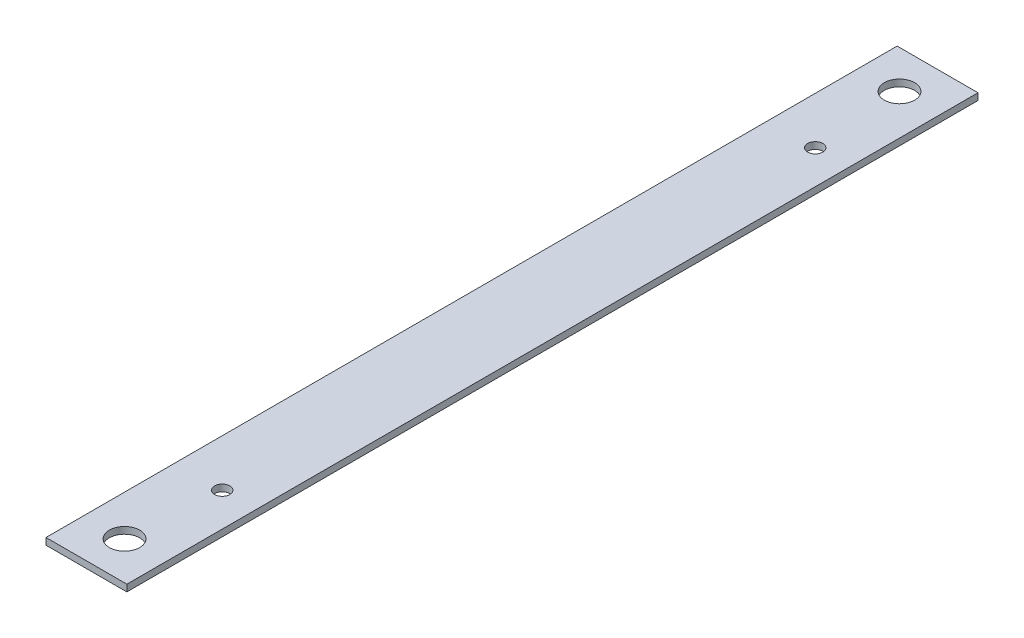
ISO-10303-21;
HEADER;
FILE_DESCRIPTION(('STEP AP214'),'2;1');
FILE_NAME('part.step','',(''),(''),'','','');
FILE_SCHEMA(('AUTOMOTIVE_DESIGN { 1 0 10303 214 1 1 1 1 }'));
ENDSEC;
DATA;
#1=APPLICATION_CONTEXT('core data for automotive mechanical design processes');
#2=APPLICATION_PROTOCOL_DEFINITION('international standard','automotive_design',2000,#1);
#3=PRODUCT_CONTEXT('',#1,'mechanical');
#4=PRODUCT('Part','Part','',(#3));
#5=PRODUCT_RELATED_PRODUCT_CATEGORY('part','',(#4));
#6=PRODUCT_DEFINITION_FORMATION('','',#4);
#7=PRODUCT_DEFINITION_CONTEXT('part definition',#1,'design');
#8=PRODUCT_DEFINITION('design','',#6,#7);
#9=PRODUCT_DEFINITION_SHAPE('','',#8);
#10=(LENGTH_UNIT() NAMED_UNIT(*) SI_UNIT(.MILLI.,.METRE.));
#11=(NAMED_UNIT(*) PLANE_ANGLE_UNIT() SI_UNIT($,.RADIAN.));
#12=(NAMED_UNIT(*) SI_UNIT($,.STERADIAN.) SOLID_ANGLE_UNIT());
#13=UNCERTAINTY_MEASURE_WITH_UNIT(LENGTH_MEASURE(1.E-05),#10,'distance_accuracy_value','');
#14=(GEOMETRIC_REPRESENTATION_CONTEXT(3) GLOBAL_UNCERTAINTY_ASSIGNED_CONTEXT((#13)) GLOBAL_UNIT_ASSIGNED_CONTEXT((#10,
#11,#12)) REPRESENTATION_CONTEXT('',''));
#15=CARTESIAN_POINT('',(0.,0.,0.));
#16=DIRECTION('',(0.,0.,1.));
#17=DIRECTION('',(1.,0.,0.));
#18=AXIS2_PLACEMENT_3D('',#15,#16,#17);
#19=CARTESIAN_POINT('',(0.,0.,401.0152));
#20=DIRECTION('',(1.,0.,0.));
#21=DIRECTION('',(0.,0.,-1.));
#22=AXIS2_PLACEMENT_3D('',#19,#20,#21);
#23=PLANE('',#22);
#24=DIRECTION('',(0.,-1.,0.));
#25=VECTOR('',#24,1.);
#26=CARTESIAN_POINT('',(0.,0.,0.));
#27=LINE('',#26,#25);
#28=CARTESIAN_POINT('',(0.,3.175,0.));
#29=VERTEX_POINT('',#28);
#30=CARTESIAN_POINT('',(0.,0.,0.));
#31=VERTEX_POINT('',#30);
#32=EDGE_CURVE('E95',#29,#31,#27,.T.);
#33=ORIENTED_EDGE('',*,*,#32,.T.);
#34=DIRECTION('',(0.,0.,-1.));
#35=VECTOR('',#34,1.);
#36=CARTESIAN_POINT('',(0.,0.,401.0152));
#37=LINE('',#36,#35);
#38=CARTESIAN_POINT('',(0.,0.,401.0152));
#39=VERTEX_POINT('',#38);
#40=EDGE_CURVE('E11',#39,#31,#37,.T.);
#41=ORIENTED_EDGE('',*,*,#40,.F.);
#42=DIRECTION('',(0.,-1.,0.));
#43=VECTOR('',#42,1.);
#44=CARTESIAN_POINT('',(0.,0.,401.0152));
#45=LINE('',#44,#43);
#46=CARTESIAN_POINT('',(0.,3.175,401.0152));
#47=VERTEX_POINT('',#46);
#48=EDGE_CURVE('E83',#47,#39,#45,.T.);
#49=ORIENTED_EDGE('',*,*,#48,.F.);
#50=DIRECTION('',(0.,0.,-1.));
#51=VECTOR('',#50,1.);
#52=CARTESIAN_POINT('',(0.,3.175,401.0152));
#53=LINE('',#52,#51);
#54=EDGE_CURVE('E91',#47,#29,#53,.T.);
#55=ORIENTED_EDGE('',*,*,#54,.T.);
#56=EDGE_LOOP('',(#33,#41,#49,#55));
#57=FACE_BOUND('',#56,.T.);
#58=ADVANCED_FACE('F32',(#57),#23,.F.);
#59=CARTESIAN_POINT('',(0.,0.,401.0152));
#60=DIRECTION('',(0.,1.,0.));
#61=DIRECTION('',(0.,0.,1.));
#62=AXIS2_PLACEMENT_3D('',#59,#60,#61);
#63=PLANE('',#62);
#64=CARTESIAN_POINT('',(22.225,0.,340.2076));
#65=DIRECTION('',(0.,1.,0.));
#66=DIRECTION('',(0.,0.,-1.));
#67=AXIS2_PLACEMENT_3D('',#64,#65,#66);
#68=CIRCLE('',#67,3.55599999999999);
#69=CARTESIAN_POINT('',(22.225,0.,336.6516));
#70=VERTEX_POINT('',#69);
#71=EDGE_CURVE('E124',#70,#70,#68,.T.);
#72=ORIENTED_EDGE('',*,*,#71,.T.);
#73=EDGE_LOOP('',(#72));
#74=FACE_BOUND('',#73,.T.);
#75=CARTESIAN_POINT('',(22.225,0.,60.8076));
#76=DIRECTION('',(0.,1.,0.));
#77=DIRECTION('',(0.,0.,1.));
#78=AXIS2_PLACEMENT_3D('',#75,#76,#77);
#79=CIRCLE('',#78,3.556);
#80=CARTESIAN_POINT('',(22.225,0.,64.3636));
#81=VERTEX_POINT('',#80);
#82=EDGE_CURVE('E118',#81,#81,#79,.T.);
#83=ORIENTED_EDGE('',*,*,#82,.T.);
#84=EDGE_LOOP('',(#83));
#85=FACE_BOUND('',#84,.T.);
#86=CARTESIAN_POINT('',(19.05,0.,17.9451));
#87=DIRECTION('',(0.,1.,0.));
#88=DIRECTION('',(0.,0.,1.));
#89=AXIS2_PLACEMENT_3D('',#86,#87,#88);
#90=CIRCLE('',#89,7.14375);
#91=CARTESIAN_POINT('',(19.05,0.,25.08885));
#92=VERTEX_POINT('',#91);
#93=EDGE_CURVE('E112',#92,#92,#90,.T.);
#94=ORIENTED_EDGE('',*,*,#93,.T.);
#95=EDGE_LOOP('',(#94));
#96=FACE_BOUND('',#95,.T.);
#97=CARTESIAN_POINT('',(19.05,0.,383.0701));
#98=DIRECTION('',(0.,1.,0.));
#99=DIRECTION('',(0.,0.,1.));
#100=AXIS2_PLACEMENT_3D('',#97,#98,#99);
#101=CIRCLE('',#100,7.14375000000003);
#102=CARTESIAN_POINT('',(19.05,0.,390.21385));
#103=VERTEX_POINT('',#102);
#104=EDGE_CURVE('E98',#103,#103,#101,.T.);
#105=ORIENTED_EDGE('',*,*,#104,.T.);
#106=EDGE_LOOP('',(#105));
#107=FACE_BOUND('',#106,.T.);
#108=DIRECTION('',(1.,0.,0.));
#109=VECTOR('',#108,1.);
#110=CARTESIAN_POINT('',(0.,0.,0.));
#111=LINE('',#110,#109);
#112=CARTESIAN_POINT('',(38.1,0.,0.));
#113=VERTEX_POINT('',#112);
#114=EDGE_CURVE('E87',#31,#113,#111,.T.);
#115=ORIENTED_EDGE('',*,*,#114,.T.);
#116=DIRECTION('',(0.,0.,-1.));
#117=VECTOR('',#116,1.);
#118=CARTESIAN_POINT('',(38.1,0.,401.0152));
#119=LINE('',#118,#117);
#120=CARTESIAN_POINT('',(38.1,0.,401.0152));
#121=VERTEX_POINT('',#120);
#122=EDGE_CURVE('E40',#121,#113,#119,.T.);
#123=ORIENTED_EDGE('',*,*,#122,.F.);
#124=DIRECTION('',(1.,0.,0.));
#125=VECTOR('',#124,1.);
#126=CARTESIAN_POINT('',(0.,0.,401.0152));
#127=LINE('',#126,#125);
#128=EDGE_CURVE('E78',#39,#121,#127,.T.);
#129=ORIENTED_EDGE('',*,*,#128,.F.);
#130=ORIENTED_EDGE('',*,*,#40,.T.);
#131=EDGE_LOOP('',(#115,#123,#129,#130));
#132=FACE_BOUND('',#131,.T.);
#133=ADVANCED_FACE('F86',(#74,#85,#96,#107,#132),#63,.F.);
#134=CARTESIAN_POINT('',(38.1,0.,401.0152));
#135=DIRECTION('',(-1.,0.,0.));
#136=DIRECTION('',(0.,0.,1.));
#137=AXIS2_PLACEMENT_3D('',#134,#135,#136);
#138=PLANE('',#137);
#139=DIRECTION('',(0.,1.,0.));
#140=VECTOR('',#139,1.);
#141=CARTESIAN_POINT('',(38.1,0.,0.));
#142=LINE('',#141,#140);
#143=CARTESIAN_POINT('',(38.1,3.175,0.));
#144=VERTEX_POINT('',#143);
#145=EDGE_CURVE('E65',#113,#144,#142,.T.);
#146=ORIENTED_EDGE('',*,*,#145,.T.);
#147=DIRECTION('',(0.,0.,-1.));
#148=VECTOR('',#147,1.);
#149=CARTESIAN_POINT('',(38.1,3.175,401.0152));
#150=LINE('',#149,#148);
#151=CARTESIAN_POINT('',(38.1,3.175,401.0152));
#152=VERTEX_POINT('',#151);
#153=EDGE_CURVE('E88',#152,#144,#150,.T.);
#154=ORIENTED_EDGE('',*,*,#153,.F.);
#155=DIRECTION('',(0.,1.,0.));
#156=VECTOR('',#155,1.);
#157=CARTESIAN_POINT('',(38.1,0.,401.0152));
#158=LINE('',#157,#156);
#159=EDGE_CURVE('E81',#121,#152,#158,.T.);
#160=ORIENTED_EDGE('',*,*,#159,.F.);
#161=ORIENTED_EDGE('',*,*,#122,.T.);
#162=EDGE_LOOP('',(#146,#154,#160,#161));
#163=FACE_BOUND('',#162,.T.);
#164=ADVANCED_FACE('F89',(#163),#138,.F.);
#165=CARTESIAN_POINT('',(0.,3.175,401.0152));
#166=DIRECTION('',(0.,-1.,0.));
#167=DIRECTION('',(0.,0.,-1.));
#168=AXIS2_PLACEMENT_3D('',#165,#166,#167);
#169=PLANE('',#168);
#170=CARTESIAN_POINT('',(22.225,3.175,340.2076));
#171=DIRECTION('',(0.,1.,0.));
#172=DIRECTION('',(0.,0.,-1.));
#173=AXIS2_PLACEMENT_3D('',#170,#171,#172);
#174=CIRCLE('',#173,3.55599999999999);
#175=CARTESIAN_POINT('',(22.225,3.175,336.6516));
#176=VERTEX_POINT('',#175);
#177=EDGE_CURVE('E127',#176,#176,#174,.T.);
#178=ORIENTED_EDGE('',*,*,#177,.F.);
#179=EDGE_LOOP('',(#178));
#180=FACE_BOUND('',#179,.T.);
#181=CARTESIAN_POINT('',(22.225,3.175,60.8076));
#182=DIRECTION('',(0.,1.,0.));
#183=DIRECTION('',(0.,0.,1.));
#184=AXIS2_PLACEMENT_3D('',#181,#182,#183);
#185=CIRCLE('',#184,3.556);
#186=CARTESIAN_POINT('',(22.225,3.175,64.3636));
#187=VERTEX_POINT('',#186);
#188=EDGE_CURVE('E121',#187,#187,#185,.T.);
#189=ORIENTED_EDGE('',*,*,#188,.F.);
#190=EDGE_LOOP('',(#189));
#191=FACE_BOUND('',#190,.T.);
#192=CARTESIAN_POINT('',(19.05,3.175,17.9451));
#193=DIRECTION('',(0.,1.,0.));
#194=DIRECTION('',(0.,0.,1.));
#195=AXIS2_PLACEMENT_3D('',#192,#193,#194);
#196=CIRCLE('',#195,7.14375);
#197=CARTESIAN_POINT('',(19.05,3.175,25.08885));
#198=VERTEX_POINT('',#197);
#199=EDGE_CURVE('E115',#198,#198,#196,.T.);
#200=ORIENTED_EDGE('',*,*,#199,.F.);
#201=EDGE_LOOP('',(#200));
#202=FACE_BOUND('',#201,.T.);
#203=CARTESIAN_POINT('',(19.05,3.175,383.0701));
#204=DIRECTION('',(0.,1.,0.));
#205=DIRECTION('',(0.,0.,1.));
#206=AXIS2_PLACEMENT_3D('',#203,#204,#205);
#207=CIRCLE('',#206,7.14375000000003);
#208=CARTESIAN_POINT('',(19.05,3.175,390.21385));
#209=VERTEX_POINT('',#208);
#210=EDGE_CURVE('E109',#209,#209,#207,.T.);
#211=ORIENTED_EDGE('',*,*,#210,.F.);
#212=EDGE_LOOP('',(#211));
#213=FACE_BOUND('',#212,.T.);
#214=DIRECTION('',(-1.,0.,0.));
#215=VECTOR('',#214,1.);
#216=CARTESIAN_POINT('',(0.,3.175,0.));
#217=LINE('',#216,#215);
#218=EDGE_CURVE('E71',#144,#29,#217,.T.);
#219=ORIENTED_EDGE('',*,*,#218,.T.);
#220=ORIENTED_EDGE('',*,*,#54,.F.);
#221=DIRECTION('',(-1.,0.,0.));
#222=VECTOR('',#221,1.);
#223=CARTESIAN_POINT('',(0.,3.175,401.0152));
#224=LINE('',#223,#222);
#225=EDGE_CURVE('E48',#152,#47,#224,.T.);
#226=ORIENTED_EDGE('',*,*,#225,.F.);
#227=ORIENTED_EDGE('',*,*,#153,.T.);
#228=EDGE_LOOP('',(#219,#220,#226,#227));
#229=FACE_BOUND('',#228,.T.);
#230=ADVANCED_FACE('F103',(#180,#191,#202,#213,#229),#169,.F.);
#231=CARTESIAN_POINT('',(0.,0.,401.0152));
#232=DIRECTION('',(0.,0.,-1.));
#233=DIRECTION('',(-1.,0.,0.));
#234=AXIS2_PLACEMENT_3D('',#231,#232,#233);
#235=PLANE('',#234);
#236=ORIENTED_EDGE('',*,*,#48,.T.);
#237=ORIENTED_EDGE('',*,*,#128,.T.);
#238=ORIENTED_EDGE('',*,*,#159,.T.);
#239=ORIENTED_EDGE('',*,*,#225,.T.);
#240=EDGE_LOOP('',(#236,#237,#238,#239));
#241=FACE_BOUND('',#240,.T.);
#242=ADVANCED_FACE('F79',(#241),#235,.F.);
#243=CARTESIAN_POINT('',(0.,0.,0.));
#244=DIRECTION('',(0.,0.,-1.));
#245=DIRECTION('',(-1.,0.,0.));
#246=AXIS2_PLACEMENT_3D('',#243,#244,#245);
#247=PLANE('',#246);
#248=ORIENTED_EDGE('',*,*,#32,.F.);
#249=ORIENTED_EDGE('',*,*,#218,.F.);
#250=ORIENTED_EDGE('',*,*,#145,.F.);
#251=ORIENTED_EDGE('',*,*,#114,.F.);
#252=EDGE_LOOP('',(#248,#249,#250,#251));
#253=FACE_BOUND('',#252,.T.);
#254=ADVANCED_FACE('F106',(#253),#247,.T.);
#255=CARTESIAN_POINT('',(19.05,0.,383.0701));
#256=DIRECTION('',(0.,1.,0.));
#257=DIRECTION('',(0.,0.,1.));
#258=AXIS2_PLACEMENT_3D('',#255,#256,#257);
#259=CYLINDRICAL_SURFACE('',#258,7.14375000000003);
#260=ORIENTED_EDGE('',*,*,#104,.F.);
#261=EDGE_LOOP('',(#260));
#262=FACE_BOUND('',#261,.T.);
#263=ORIENTED_EDGE('',*,*,#210,.T.);
#264=EDGE_LOOP('',(#263));
#265=FACE_BOUND('',#264,.T.);
#266=ADVANCED_FACE('F151',(#262,#265),#259,.F.);
#267=CARTESIAN_POINT('',(19.05,0.,17.9451));
#268=DIRECTION('',(0.,1.,0.));
#269=DIRECTION('',(0.,0.,1.));
#270=AXIS2_PLACEMENT_3D('',#267,#268,#269);
#271=CYLINDRICAL_SURFACE('',#270,7.14375);
#272=ORIENTED_EDGE('',*,*,#93,.F.);
#273=EDGE_LOOP('',(#272));
#274=FACE_BOUND('',#273,.T.);
#275=ORIENTED_EDGE('',*,*,#199,.T.);
#276=EDGE_LOOP('',(#275));
#277=FACE_BOUND('',#276,.T.);
#278=ADVANCED_FACE('F153',(#274,#277),#271,.F.);
#279=CARTESIAN_POINT('',(22.225,0.,60.8076));
#280=DIRECTION('',(0.,1.,0.));
#281=DIRECTION('',(0.,0.,1.));
#282=AXIS2_PLACEMENT_3D('',#279,#280,#281);
#283=CYLINDRICAL_SURFACE('',#282,3.556);
#284=ORIENTED_EDGE('',*,*,#82,.F.);
#285=EDGE_LOOP('',(#284));
#286=FACE_BOUND('',#285,.T.);
#287=ORIENTED_EDGE('',*,*,#188,.T.);
#288=EDGE_LOOP('',(#287));
#289=FACE_BOUND('',#288,.T.);
#290=ADVANCED_FACE('F138',(#286,#289),#283,.F.);
#291=CARTESIAN_POINT('',(22.225,0.,340.2076));
#292=DIRECTION('',(0.,1.,0.));
#293=DIRECTION('',(0.,0.,1.));
#294=AXIS2_PLACEMENT_3D('',#291,#292,#293);
#295=CYLINDRICAL_SURFACE('',#294,3.55599999999999);
#296=ORIENTED_EDGE('',*,*,#71,.F.);
#297=EDGE_LOOP('',(#296));
#298=FACE_BOUND('',#297,.T.);
#299=ORIENTED_EDGE('',*,*,#177,.T.);
#300=EDGE_LOOP('',(#299));
#301=FACE_BOUND('',#300,.T.);
#302=ADVANCED_FACE('F135',(#298,#301),#295,.F.);
#303=CLOSED_SHELL('',(#58,#133,#164,#230,#242,#254,#266,#278,#290,#302));
#304=MANIFOLD_SOLID_BREP('B2',#303);
#305=ADVANCED_BREP_SHAPE_REPRESENTATION('',(#18,#304),#14);
#306=SHAPE_DEFINITION_REPRESENTATION(#9,#305);
ENDSEC;
END-ISO-10303-21;
